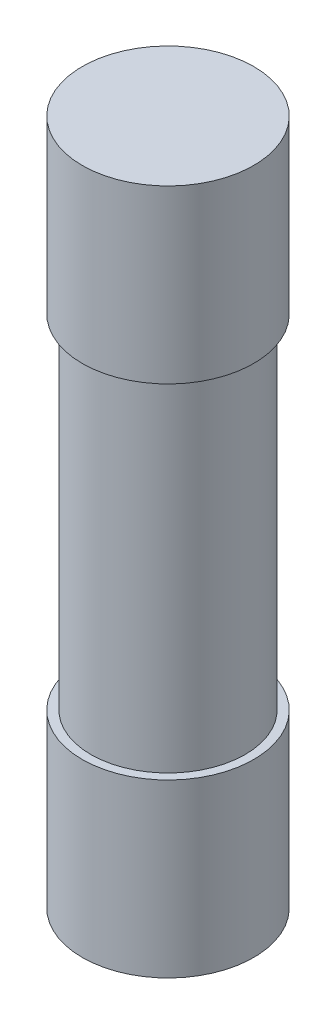
ISO-10303-21;
HEADER;
FILE_DESCRIPTION(('STEP AP214'),'2;1');
FILE_NAME('part.step','',(''),(''),'','','');
FILE_SCHEMA(('AUTOMOTIVE_DESIGN { 1 0 10303 214 1 1 1 1 }'));
ENDSEC;
DATA;
#1=APPLICATION_CONTEXT('core data for automotive mechanical design processes');
#2=APPLICATION_PROTOCOL_DEFINITION('international standard','automotive_design',2000,#1);
#3=PRODUCT_CONTEXT('',#1,'mechanical');
#4=PRODUCT('Part','Part','',(#3));
#5=PRODUCT_RELATED_PRODUCT_CATEGORY('part','',(#4));
#6=PRODUCT_DEFINITION_FORMATION('','',#4);
#7=PRODUCT_DEFINITION_CONTEXT('part definition',#1,'design');
#8=PRODUCT_DEFINITION('design','',#6,#7);
#9=PRODUCT_DEFINITION_SHAPE('','',#8);
#10=(LENGTH_UNIT() NAMED_UNIT(*) SI_UNIT(.MILLI.,.METRE.));
#11=(NAMED_UNIT(*) PLANE_ANGLE_UNIT() SI_UNIT($,.RADIAN.));
#12=(NAMED_UNIT(*) SI_UNIT($,.STERADIAN.) SOLID_ANGLE_UNIT());
#13=UNCERTAINTY_MEASURE_WITH_UNIT(LENGTH_MEASURE(1.E-05),#10,'distance_accuracy_value','');
#14=(GEOMETRIC_REPRESENTATION_CONTEXT(3) GLOBAL_UNCERTAINTY_ASSIGNED_CONTEXT((#13)) GLOBAL_UNIT_ASSIGNED_CONTEXT((#10,
#11,#12)) REPRESENTATION_CONTEXT('',''));
#15=CARTESIAN_POINT('',(0.,0.,0.));
#16=DIRECTION('',(0.,0.,1.));
#17=DIRECTION('',(1.,0.,0.));
#18=AXIS2_PLACEMENT_3D('',#15,#16,#17);
#19=CARTESIAN_POINT('',(0.,20.,0.));
#20=DIRECTION('',(0.,-1.,0.));
#21=DIRECTION('',(0.,0.,-1.));
#22=AXIS2_PLACEMENT_3D('',#19,#20,#21);
#23=CYLINDRICAL_SURFACE('',#22,2.5);
#24=CARTESIAN_POINT('',(0.,20.,0.));
#25=DIRECTION('',(0.,1.,0.));
#26=DIRECTION('',(0.,0.,1.));
#27=AXIS2_PLACEMENT_3D('',#24,#25,#26);
#28=CIRCLE('',#27,2.5);
#29=CARTESIAN_POINT('',(0.,20.,2.5));
#30=VERTEX_POINT('',#29);
#31=EDGE_CURVE('E11',#30,#30,#28,.T.);
#32=ORIENTED_EDGE('',*,*,#31,.F.);
#33=EDGE_LOOP('',(#32));
#34=FACE_BOUND('',#33,.T.);
#35=CARTESIAN_POINT('',(0.,15.,0.));
#36=DIRECTION('',(0.,1.,0.));
#37=DIRECTION('',(0.,0.,1.));
#38=AXIS2_PLACEMENT_3D('',#35,#36,#37);
#39=CIRCLE('',#38,2.5);
#40=CARTESIAN_POINT('',(0.,15.,2.5));
#41=VERTEX_POINT('',#40);
#42=EDGE_CURVE('E46',#41,#41,#39,.T.);
#43=ORIENTED_EDGE('',*,*,#42,.T.);
#44=EDGE_LOOP('',(#43));
#45=FACE_BOUND('',#44,.T.);
#46=ADVANCED_FACE('F43',(#34,#45),#23,.T.);
#47=CARTESIAN_POINT('',(0.,20.,0.));
#48=DIRECTION('',(0.,1.,0.));
#49=DIRECTION('',(0.,0.,1.));
#50=AXIS2_PLACEMENT_3D('',#47,#48,#49);
#51=PLANE('',#50);
#52=ORIENTED_EDGE('',*,*,#31,.T.);
#53=EDGE_LOOP('',(#52));
#54=FACE_BOUND('',#53,.T.);
#55=ADVANCED_FACE('F58',(#54),#51,.T.);
#56=CARTESIAN_POINT('',(0.,15.,0.));
#57=DIRECTION('',(0.,1.,0.));
#58=DIRECTION('',(0.,0.,1.));
#59=AXIS2_PLACEMENT_3D('',#56,#57,#58);
#60=PLANE('',#59);
#61=ORIENTED_EDGE('',*,*,#42,.F.);
#62=EDGE_LOOP('',(#61));
#63=FACE_BOUND('',#62,.T.);
#64=ADVANCED_FACE('F56',(#63),#60,.F.);
#65=CLOSED_SHELL('',(#46,#55,#64));
#66=MANIFOLD_SOLID_BREP('B2',#65);
#67=CARTESIAN_POINT('',(0.,15.,0.));
#68=DIRECTION('',(0.,-1.,0.));
#69=DIRECTION('',(0.,0.,-1.));
#70=AXIS2_PLACEMENT_3D('',#67,#68,#69);
#71=CYLINDRICAL_SURFACE('',#70,2.25);
#72=CARTESIAN_POINT('',(0.,15.,0.));
#73=DIRECTION('',(0.,1.,0.));
#74=DIRECTION('',(0.,0.,1.));
#75=AXIS2_PLACEMENT_3D('',#72,#73,#74);
#76=CIRCLE('',#75,2.25);
#77=CARTESIAN_POINT('',(0.,15.,2.25));
#78=VERTEX_POINT('',#77);
#79=EDGE_CURVE('E42',#78,#78,#76,.T.);
#80=ORIENTED_EDGE('',*,*,#79,.F.);
#81=EDGE_LOOP('',(#80));
#82=FACE_BOUND('',#81,.T.);
#83=CARTESIAN_POINT('',(0.,5.,0.));
#84=DIRECTION('',(0.,1.,0.));
#85=DIRECTION('',(0.,0.,1.));
#86=AXIS2_PLACEMENT_3D('',#83,#84,#85);
#87=CIRCLE('',#86,2.25);
#88=CARTESIAN_POINT('',(0.,5.,2.25));
#89=VERTEX_POINT('',#88);
#90=EDGE_CURVE('E93',#89,#89,#87,.T.);
#91=ORIENTED_EDGE('',*,*,#90,.T.);
#92=EDGE_LOOP('',(#91));
#93=FACE_BOUND('',#92,.T.);
#94=ADVANCED_FACE('F90',(#82,#93),#71,.T.);
#95=CARTESIAN_POINT('',(0.,15.,0.));
#96=DIRECTION('',(0.,1.,0.));
#97=DIRECTION('',(0.,0.,1.));
#98=AXIS2_PLACEMENT_3D('',#95,#96,#97);
#99=PLANE('',#98);
#100=ORIENTED_EDGE('',*,*,#79,.T.);
#101=EDGE_LOOP('',(#100));
#102=FACE_BOUND('',#101,.T.);
#103=ADVANCED_FACE('F105',(#102),#99,.T.);
#104=CARTESIAN_POINT('',(0.,5.,0.));
#105=DIRECTION('',(0.,1.,0.));
#106=DIRECTION('',(0.,0.,1.));
#107=AXIS2_PLACEMENT_3D('',#104,#105,#106);
#108=PLANE('',#107);
#109=ORIENTED_EDGE('',*,*,#90,.F.);
#110=EDGE_LOOP('',(#109));
#111=FACE_BOUND('',#110,.T.);
#112=ADVANCED_FACE('F103',(#111),#108,.F.);
#113=CLOSED_SHELL('',(#94,#103,#112));
#114=MANIFOLD_SOLID_BREP('B6',#113);
#115=CARTESIAN_POINT('',(0.,5.,0.));
#116=DIRECTION('',(0.,-1.,0.));
#117=DIRECTION('',(0.,0.,-1.));
#118=AXIS2_PLACEMENT_3D('',#115,#116,#117);
#119=CYLINDRICAL_SURFACE('',#118,2.5);
#120=CARTESIAN_POINT('',(0.,5.,0.));
#121=DIRECTION('',(0.,1.,0.));
#122=DIRECTION('',(0.,0.,1.));
#123=AXIS2_PLACEMENT_3D('',#120,#121,#122);
#124=CIRCLE('',#123,2.5);
#125=CARTESIAN_POINT('',(0.,5.,2.5));
#126=VERTEX_POINT('',#125);
#127=EDGE_CURVE('E89',#126,#126,#124,.T.);
#128=ORIENTED_EDGE('',*,*,#127,.F.);
#129=EDGE_LOOP('',(#128));
#130=FACE_BOUND('',#129,.T.);
#131=CARTESIAN_POINT('',(0.,0.,0.));
#132=DIRECTION('',(0.,1.,0.));
#133=DIRECTION('',(0.,0.,1.));
#134=AXIS2_PLACEMENT_3D('',#131,#132,#133);
#135=CIRCLE('',#134,2.5);
#136=CARTESIAN_POINT('',(0.,0.,2.5));
#137=VERTEX_POINT('',#136);
#138=EDGE_CURVE('E133',#137,#137,#135,.T.);
#139=ORIENTED_EDGE('',*,*,#138,.T.);
#140=EDGE_LOOP('',(#139));
#141=FACE_BOUND('',#140,.T.);
#142=ADVANCED_FACE('F130',(#130,#141),#119,.T.);
#143=CARTESIAN_POINT('',(0.,5.,0.));
#144=DIRECTION('',(0.,1.,0.));
#145=DIRECTION('',(0.,0.,1.));
#146=AXIS2_PLACEMENT_3D('',#143,#144,#145);
#147=PLANE('',#146);
#148=ORIENTED_EDGE('',*,*,#127,.T.);
#149=EDGE_LOOP('',(#148));
#150=FACE_BOUND('',#149,.T.);
#151=ADVANCED_FACE('F145',(#150),#147,.T.);
#152=CARTESIAN_POINT('',(0.,0.,0.));
#153=DIRECTION('',(0.,1.,0.));
#154=DIRECTION('',(0.,0.,1.));
#155=AXIS2_PLACEMENT_3D('',#152,#153,#154);
#156=PLANE('',#155);
#157=ORIENTED_EDGE('',*,*,#138,.F.);
#158=EDGE_LOOP('',(#157));
#159=FACE_BOUND('',#158,.T.);
#160=ADVANCED_FACE('F143',(#159),#156,.F.);
#161=CLOSED_SHELL('',(#142,#151,#160));
#162=MANIFOLD_SOLID_BREP('B37',#161);
#163=ADVANCED_BREP_SHAPE_REPRESENTATION('',(#18,#66,#114,#162),#14);
#164=SHAPE_DEFINITION_REPRESENTATION(#9,#163);
ENDSEC;
END-ISO-10303-21;
